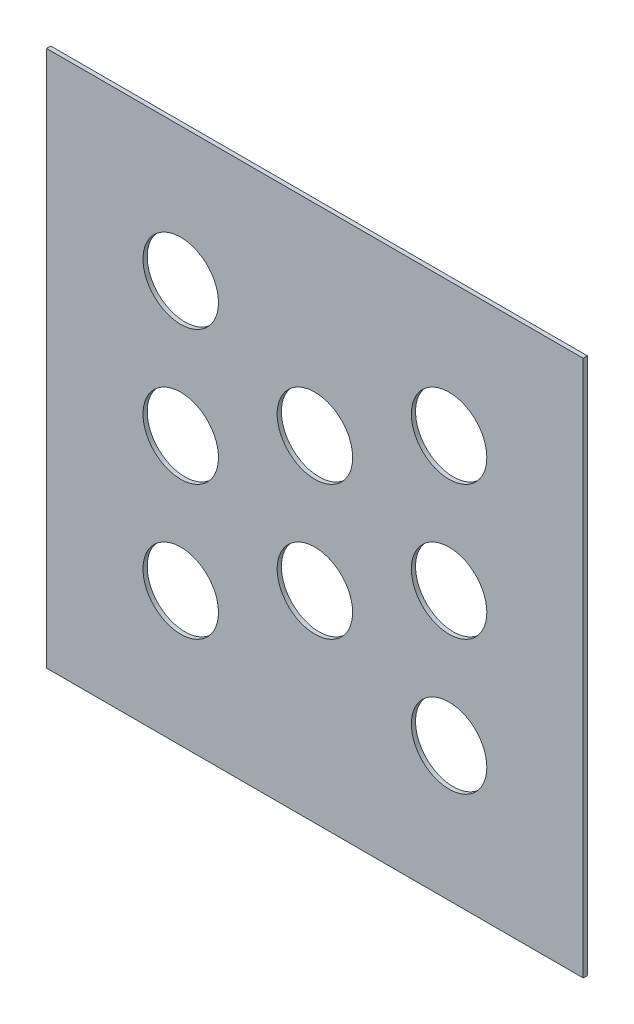
ISO-10303-21;
HEADER;
FILE_DESCRIPTION(('STEP AP214'),'2;1');
FILE_NAME('part.step','',(''),(''),'','','');
FILE_SCHEMA(('AUTOMOTIVE_DESIGN { 1 0 10303 214 1 1 1 1 }'));
ENDSEC;
DATA;
#1=APPLICATION_CONTEXT('core data for automotive mechanical design processes');
#2=APPLICATION_PROTOCOL_DEFINITION('international standard','automotive_design',2000,#1);
#3=PRODUCT_CONTEXT('',#1,'mechanical');
#4=PRODUCT('Part','Part','',(#3));
#5=PRODUCT_RELATED_PRODUCT_CATEGORY('part','',(#4));
#6=PRODUCT_DEFINITION_FORMATION('','',#4);
#7=PRODUCT_DEFINITION_CONTEXT('part definition',#1,'design');
#8=PRODUCT_DEFINITION('design','',#6,#7);
#9=PRODUCT_DEFINITION_SHAPE('','',#8);
#10=(LENGTH_UNIT() NAMED_UNIT(*) SI_UNIT(.MILLI.,.METRE.));
#11=(NAMED_UNIT(*) PLANE_ANGLE_UNIT() SI_UNIT($,.RADIAN.));
#12=(NAMED_UNIT(*) SI_UNIT($,.STERADIAN.) SOLID_ANGLE_UNIT());
#13=UNCERTAINTY_MEASURE_WITH_UNIT(LENGTH_MEASURE(1.E-05),#10,'distance_accuracy_value','');
#14=(GEOMETRIC_REPRESENTATION_CONTEXT(3) GLOBAL_UNCERTAINTY_ASSIGNED_CONTEXT((#13)) GLOBAL_UNIT_ASSIGNED_CONTEXT((#10,
#11,#12)) REPRESENTATION_CONTEXT('',''));
#15=CARTESIAN_POINT('',(0.,0.,0.));
#16=DIRECTION('',(0.,0.,1.));
#17=DIRECTION('',(1.,0.,0.));
#18=AXIS2_PLACEMENT_3D('',#15,#16,#17);
#19=CARTESIAN_POINT('',(0.,-203.2,1.5875));
#20=DIRECTION('',(0.,0.,1.));
#21=DIRECTION('',(1.,0.,0.));
#22=AXIS2_PLACEMENT_3D('',#19,#20,#21);
#23=PLANE('',#22);
#24=CARTESIAN_POINT('',(50.800000000001,-152.400000000001,1.5875));
#25=DIRECTION('',(0.,0.,1.));
#26=DIRECTION('',(1.,0.,0.));
#27=AXIS2_PLACEMENT_3D('',#24,#25,#26);
#28=CIRCLE('',#27,14.2875);
#29=CARTESIAN_POINT('',(65.087500000001,-152.400000000001,1.5875));
#30=VERTEX_POINT('',#29);
#31=EDGE_CURVE('E148',#30,#30,#28,.T.);
#32=ORIENTED_EDGE('',*,*,#31,.F.);
#33=EDGE_LOOP('',(#32));
#34=FACE_BOUND('',#33,.T.);
#35=CARTESIAN_POINT('',(50.8,-50.8000000000007,1.5875));
#36=DIRECTION('',(0.,0.,1.));
#37=DIRECTION('',(1.,0.,0.));
#38=AXIS2_PLACEMENT_3D('',#35,#36,#37);
#39=CIRCLE('',#38,14.2875);
#40=CARTESIAN_POINT('',(65.0875,-50.8000000000007,1.5875));
#41=VERTEX_POINT('',#40);
#42=EDGE_CURVE('E136',#41,#41,#39,.T.);
#43=ORIENTED_EDGE('',*,*,#42,.F.);
#44=EDGE_LOOP('',(#43));
#45=FACE_BOUND('',#44,.T.);
#46=CARTESIAN_POINT('',(152.400000000001,-101.6,1.5875));
#47=DIRECTION('',(0.,0.,1.));
#48=DIRECTION('',(1.,0.,0.));
#49=AXIS2_PLACEMENT_3D('',#46,#47,#48);
#50=CIRCLE('',#49,14.2875);
#51=CARTESIAN_POINT('',(166.687500000001,-101.6,1.5875));
#52=VERTEX_POINT('',#51);
#53=EDGE_CURVE('E124',#52,#52,#50,.T.);
#54=ORIENTED_EDGE('',*,*,#53,.F.);
#55=EDGE_LOOP('',(#54));
#56=FACE_BOUND('',#55,.T.);
#57=CARTESIAN_POINT('',(152.4,-50.8,1.5875));
#58=DIRECTION('',(0.,0.,1.));
#59=DIRECTION('',(1.,0.,0.));
#60=AXIS2_PLACEMENT_3D('',#57,#58,#59);
#61=CIRCLE('',#60,14.2875);
#62=CARTESIAN_POINT('',(166.6875,-50.8,1.5875));
#63=VERTEX_POINT('',#62);
#64=EDGE_CURVE('E103',#63,#63,#61,.T.);
#65=ORIENTED_EDGE('',*,*,#64,.F.);
#66=EDGE_LOOP('',(#65));
#67=FACE_BOUND('',#66,.T.);
#68=DIRECTION('',(0.,-1.,0.));
#69=VECTOR('',#68,1.);
#70=CARTESIAN_POINT('',(0.,0.,1.5875));
#71=LINE('',#70,#69);
#72=CARTESIAN_POINT('',(0.,0.,1.5875));
#73=VERTEX_POINT('',#72);
#74=CARTESIAN_POINT('',(0.,-203.2,1.5875));
#75=VERTEX_POINT('',#74);
#76=EDGE_CURVE('E88',#73,#75,#71,.T.);
#77=ORIENTED_EDGE('',*,*,#76,.T.);
#78=DIRECTION('',(1.,0.,0.));
#79=VECTOR('',#78,1.);
#80=CARTESIAN_POINT('',(0.,-203.2,1.5875));
#81=LINE('',#80,#79);
#82=CARTESIAN_POINT('',(203.2,-203.2,1.5875));
#83=VERTEX_POINT('',#82);
#84=EDGE_CURVE('E83',#75,#83,#81,.T.);
#85=ORIENTED_EDGE('',*,*,#84,.T.);
#86=DIRECTION('',(0.,1.,0.));
#87=VECTOR('',#86,1.);
#88=CARTESIAN_POINT('',(203.2,0.,1.5875));
#89=LINE('',#88,#87);
#90=CARTESIAN_POINT('',(203.2,0.,1.5875));
#91=VERTEX_POINT('',#90);
#92=EDGE_CURVE('E86',#83,#91,#89,.T.);
#93=ORIENTED_EDGE('',*,*,#92,.T.);
#94=DIRECTION('',(-1.,0.,0.));
#95=VECTOR('',#94,1.);
#96=CARTESIAN_POINT('',(0.,0.,1.5875));
#97=LINE('',#96,#95);
#98=EDGE_CURVE('E53',#91,#73,#97,.T.);
#99=ORIENTED_EDGE('',*,*,#98,.T.);
#100=EDGE_LOOP('',(#77,#85,#93,#99));
#101=FACE_BOUND('',#100,.T.);
#102=CARTESIAN_POINT('',(101.6,-76.2,1.5875));
#103=DIRECTION('',(0.,0.,1.));
#104=DIRECTION('',(1.,0.,0.));
#105=AXIS2_PLACEMENT_3D('',#102,#103,#104);
#106=CIRCLE('',#105,14.2875);
#107=CARTESIAN_POINT('',(115.8875,-76.2,1.5875));
#108=VERTEX_POINT('',#107);
#109=EDGE_CURVE('E118',#108,#108,#106,.T.);
#110=ORIENTED_EDGE('',*,*,#109,.F.);
#111=EDGE_LOOP('',(#110));
#112=FACE_BOUND('',#111,.T.);
#113=CARTESIAN_POINT('',(152.400000000001,-152.4,1.5875));
#114=DIRECTION('',(0.,0.,1.));
#115=DIRECTION('',(1.,0.,0.));
#116=AXIS2_PLACEMENT_3D('',#113,#114,#115);
#117=CIRCLE('',#116,14.2875);
#118=CARTESIAN_POINT('',(166.687500000001,-152.4,1.5875));
#119=VERTEX_POINT('',#118);
#120=EDGE_CURVE('E130',#119,#119,#117,.T.);
#121=ORIENTED_EDGE('',*,*,#120,.F.);
#122=EDGE_LOOP('',(#121));
#123=FACE_BOUND('',#122,.T.);
#124=CARTESIAN_POINT('',(50.8000000000005,-101.600000000001,1.5875));
#125=DIRECTION('',(0.,0.,1.));
#126=DIRECTION('',(1.,0.,0.));
#127=AXIS2_PLACEMENT_3D('',#124,#125,#126);
#128=CIRCLE('',#127,14.2875);
#129=CARTESIAN_POINT('',(65.0875000000005,-101.600000000001,1.5875));
#130=VERTEX_POINT('',#129);
#131=EDGE_CURVE('E142',#130,#130,#128,.T.);
#132=ORIENTED_EDGE('',*,*,#131,.F.);
#133=EDGE_LOOP('',(#132));
#134=FACE_BOUND('',#133,.T.);
#135=CARTESIAN_POINT('',(101.600000000001,-127.,1.5875));
#136=DIRECTION('',(0.,0.,1.));
#137=DIRECTION('',(1.,0.,0.));
#138=AXIS2_PLACEMENT_3D('',#135,#136,#137);
#139=CIRCLE('',#138,14.2875);
#140=CARTESIAN_POINT('',(115.887500000001,-127.,1.5875));
#141=VERTEX_POINT('',#140);
#142=EDGE_CURVE('E154',#141,#141,#139,.T.);
#143=ORIENTED_EDGE('',*,*,#142,.F.);
#144=EDGE_LOOP('',(#143));
#145=FACE_BOUND('',#144,.T.);
#146=ADVANCED_FACE('F36',(#34,#45,#56,#67,#101,#112,#123,#134,#145),#23,.T.);
#147=CARTESIAN_POINT('',(0.,-203.2,0.));
#148=DIRECTION('',(0.,0.,1.));
#149=DIRECTION('',(1.,0.,0.));
#150=AXIS2_PLACEMENT_3D('',#147,#148,#149);
#151=PLANE('',#150);
#152=CARTESIAN_POINT('',(50.800000000001,-152.400000000001,0.));
#153=DIRECTION('',(0.,0.,1.));
#154=DIRECTION('',(1.,0.,0.));
#155=AXIS2_PLACEMENT_3D('',#152,#153,#154);
#156=CIRCLE('',#155,14.2875);
#157=CARTESIAN_POINT('',(65.087500000001,-152.400000000001,0.));
#158=VERTEX_POINT('',#157);
#159=EDGE_CURVE('E151',#158,#158,#156,.T.);
#160=ORIENTED_EDGE('',*,*,#159,.T.);
#161=EDGE_LOOP('',(#160));
#162=FACE_BOUND('',#161,.T.);
#163=CARTESIAN_POINT('',(50.8,-50.8000000000007,0.));
#164=DIRECTION('',(0.,0.,1.));
#165=DIRECTION('',(1.,0.,0.));
#166=AXIS2_PLACEMENT_3D('',#163,#164,#165);
#167=CIRCLE('',#166,14.2875);
#168=CARTESIAN_POINT('',(65.0875,-50.8000000000007,0.));
#169=VERTEX_POINT('',#168);
#170=EDGE_CURVE('E139',#169,#169,#167,.T.);
#171=ORIENTED_EDGE('',*,*,#170,.T.);
#172=EDGE_LOOP('',(#171));
#173=FACE_BOUND('',#172,.T.);
#174=CARTESIAN_POINT('',(152.400000000001,-101.6,0.));
#175=DIRECTION('',(0.,0.,1.));
#176=DIRECTION('',(1.,0.,0.));
#177=AXIS2_PLACEMENT_3D('',#174,#175,#176);
#178=CIRCLE('',#177,14.2875);
#179=CARTESIAN_POINT('',(166.687500000001,-101.6,0.));
#180=VERTEX_POINT('',#179);
#181=EDGE_CURVE('E127',#180,#180,#178,.T.);
#182=ORIENTED_EDGE('',*,*,#181,.T.);
#183=EDGE_LOOP('',(#182));
#184=FACE_BOUND('',#183,.T.);
#185=CARTESIAN_POINT('',(152.4,-50.8,0.));
#186=DIRECTION('',(0.,0.,1.));
#187=DIRECTION('',(1.,0.,0.));
#188=AXIS2_PLACEMENT_3D('',#185,#186,#187);
#189=CIRCLE('',#188,14.2875);
#190=CARTESIAN_POINT('',(166.6875,-50.8,0.));
#191=VERTEX_POINT('',#190);
#192=EDGE_CURVE('E115',#191,#191,#189,.T.);
#193=ORIENTED_EDGE('',*,*,#192,.T.);
#194=EDGE_LOOP('',(#193));
#195=FACE_BOUND('',#194,.T.);
#196=DIRECTION('',(0.,-1.,0.));
#197=VECTOR('',#196,1.);
#198=CARTESIAN_POINT('',(0.,0.,0.));
#199=LINE('',#198,#197);
#200=CARTESIAN_POINT('',(0.,0.,0.));
#201=VERTEX_POINT('',#200);
#202=CARTESIAN_POINT('',(0.,-203.2,0.));
#203=VERTEX_POINT('',#202);
#204=EDGE_CURVE('E100',#201,#203,#199,.T.);
#205=ORIENTED_EDGE('',*,*,#204,.F.);
#206=DIRECTION('',(-1.,0.,0.));
#207=VECTOR('',#206,1.);
#208=CARTESIAN_POINT('',(0.,0.,0.));
#209=LINE('',#208,#207);
#210=CARTESIAN_POINT('',(203.2,0.,0.));
#211=VERTEX_POINT('',#210);
#212=EDGE_CURVE('E76',#211,#201,#209,.T.);
#213=ORIENTED_EDGE('',*,*,#212,.F.);
#214=DIRECTION('',(0.,1.,0.));
#215=VECTOR('',#214,1.);
#216=CARTESIAN_POINT('',(203.2,0.,0.));
#217=LINE('',#216,#215);
#218=CARTESIAN_POINT('',(203.2,-203.2,0.));
#219=VERTEX_POINT('',#218);
#220=EDGE_CURVE('E70',#219,#211,#217,.T.);
#221=ORIENTED_EDGE('',*,*,#220,.F.);
#222=DIRECTION('',(1.,0.,0.));
#223=VECTOR('',#222,1.);
#224=CARTESIAN_POINT('',(0.,-203.2,0.));
#225=LINE('',#224,#223);
#226=EDGE_CURVE('E92',#203,#219,#225,.T.);
#227=ORIENTED_EDGE('',*,*,#226,.F.);
#228=EDGE_LOOP('',(#205,#213,#221,#227));
#229=FACE_BOUND('',#228,.T.);
#230=CARTESIAN_POINT('',(101.6,-76.2,0.));
#231=DIRECTION('',(0.,0.,1.));
#232=DIRECTION('',(1.,0.,0.));
#233=AXIS2_PLACEMENT_3D('',#230,#231,#232);
#234=CIRCLE('',#233,14.2875);
#235=CARTESIAN_POINT('',(115.8875,-76.2,0.));
#236=VERTEX_POINT('',#235);
#237=EDGE_CURVE('E121',#236,#236,#234,.T.);
#238=ORIENTED_EDGE('',*,*,#237,.T.);
#239=EDGE_LOOP('',(#238));
#240=FACE_BOUND('',#239,.T.);
#241=CARTESIAN_POINT('',(152.400000000001,-152.4,0.));
#242=DIRECTION('',(0.,0.,1.));
#243=DIRECTION('',(1.,0.,0.));
#244=AXIS2_PLACEMENT_3D('',#241,#242,#243);
#245=CIRCLE('',#244,14.2875);
#246=CARTESIAN_POINT('',(166.687500000001,-152.4,0.));
#247=VERTEX_POINT('',#246);
#248=EDGE_CURVE('E133',#247,#247,#245,.T.);
#249=ORIENTED_EDGE('',*,*,#248,.T.);
#250=EDGE_LOOP('',(#249));
#251=FACE_BOUND('',#250,.T.);
#252=CARTESIAN_POINT('',(50.8000000000005,-101.600000000001,0.));
#253=DIRECTION('',(0.,0.,1.));
#254=DIRECTION('',(1.,0.,0.));
#255=AXIS2_PLACEMENT_3D('',#252,#253,#254);
#256=CIRCLE('',#255,14.2875);
#257=CARTESIAN_POINT('',(65.0875000000005,-101.600000000001,0.));
#258=VERTEX_POINT('',#257);
#259=EDGE_CURVE('E145',#258,#258,#256,.T.);
#260=ORIENTED_EDGE('',*,*,#259,.T.);
#261=EDGE_LOOP('',(#260));
#262=FACE_BOUND('',#261,.T.);
#263=CARTESIAN_POINT('',(101.600000000001,-127.,0.));
#264=DIRECTION('',(0.,0.,1.));
#265=DIRECTION('',(1.,0.,0.));
#266=AXIS2_PLACEMENT_3D('',#263,#264,#265);
#267=CIRCLE('',#266,14.2875);
#268=CARTESIAN_POINT('',(115.887500000001,-127.,0.));
#269=VERTEX_POINT('',#268);
#270=EDGE_CURVE('E157',#269,#269,#267,.T.);
#271=ORIENTED_EDGE('',*,*,#270,.T.);
#272=EDGE_LOOP('',(#271));
#273=FACE_BOUND('',#272,.T.);
#274=ADVANCED_FACE('F111',(#162,#173,#184,#195,#229,#240,#251,#262,#273),#151,.F.);
#275=CARTESIAN_POINT('',(0.,0.,1.5875));
#276=DIRECTION('',(1.,0.,0.));
#277=DIRECTION('',(0.,1.,0.));
#278=AXIS2_PLACEMENT_3D('',#275,#276,#277);
#279=PLANE('',#278);
#280=ORIENTED_EDGE('',*,*,#204,.T.);
#281=DIRECTION('',(0.,0.,-1.));
#282=VECTOR('',#281,1.);
#283=CARTESIAN_POINT('',(0.,-203.2,1.5875));
#284=LINE('',#283,#282);
#285=EDGE_CURVE('E11',#75,#203,#284,.T.);
#286=ORIENTED_EDGE('',*,*,#285,.F.);
#287=ORIENTED_EDGE('',*,*,#76,.F.);
#288=DIRECTION('',(0.,0.,-1.));
#289=VECTOR('',#288,1.);
#290=CARTESIAN_POINT('',(0.,0.,1.5875));
#291=LINE('',#290,#289);
#292=EDGE_CURVE('E96',#73,#201,#291,.T.);
#293=ORIENTED_EDGE('',*,*,#292,.T.);
#294=EDGE_LOOP('',(#280,#286,#287,#293));
#295=FACE_BOUND('',#294,.T.);
#296=ADVANCED_FACE('F38',(#295),#279,.F.);
#297=CARTESIAN_POINT('',(0.,-203.2,1.5875));
#298=DIRECTION('',(0.,1.,0.));
#299=DIRECTION('',(0.,0.,1.));
#300=AXIS2_PLACEMENT_3D('',#297,#298,#299);
#301=PLANE('',#300);
#302=ORIENTED_EDGE('',*,*,#226,.T.);
#303=DIRECTION('',(0.,0.,-1.));
#304=VECTOR('',#303,1.);
#305=CARTESIAN_POINT('',(203.2,-203.2,1.5875));
#306=LINE('',#305,#304);
#307=EDGE_CURVE('E45',#83,#219,#306,.T.);
#308=ORIENTED_EDGE('',*,*,#307,.F.);
#309=ORIENTED_EDGE('',*,*,#84,.F.);
#310=ORIENTED_EDGE('',*,*,#285,.T.);
#311=EDGE_LOOP('',(#302,#308,#309,#310));
#312=FACE_BOUND('',#311,.T.);
#313=ADVANCED_FACE('F91',(#312),#301,.F.);
#314=CARTESIAN_POINT('',(203.2,0.,1.5875));
#315=DIRECTION('',(-1.,0.,0.));
#316=DIRECTION('',(0.,-1.,0.));
#317=AXIS2_PLACEMENT_3D('',#314,#315,#316);
#318=PLANE('',#317);
#319=ORIENTED_EDGE('',*,*,#220,.T.);
#320=DIRECTION('',(0.,0.,-1.));
#321=VECTOR('',#320,1.);
#322=CARTESIAN_POINT('',(203.2,0.,1.5875));
#323=LINE('',#322,#321);
#324=EDGE_CURVE('E93',#91,#211,#323,.T.);
#325=ORIENTED_EDGE('',*,*,#324,.F.);
#326=ORIENTED_EDGE('',*,*,#92,.F.);
#327=ORIENTED_EDGE('',*,*,#307,.T.);
#328=EDGE_LOOP('',(#319,#325,#326,#327));
#329=FACE_BOUND('',#328,.T.);
#330=ADVANCED_FACE('F94',(#329),#318,.F.);
#331=CARTESIAN_POINT('',(0.,0.,1.5875));
#332=DIRECTION('',(0.,-1.,0.));
#333=DIRECTION('',(0.,0.,-1.));
#334=AXIS2_PLACEMENT_3D('',#331,#332,#333);
#335=PLANE('',#334);
#336=ORIENTED_EDGE('',*,*,#212,.T.);
#337=ORIENTED_EDGE('',*,*,#292,.F.);
#338=ORIENTED_EDGE('',*,*,#98,.F.);
#339=ORIENTED_EDGE('',*,*,#324,.T.);
#340=EDGE_LOOP('',(#336,#337,#338,#339));
#341=FACE_BOUND('',#340,.T.);
#342=ADVANCED_FACE('F108',(#341),#335,.F.);
#343=CARTESIAN_POINT('',(152.4,-50.8,1.5875));
#344=DIRECTION('',(0.,0.,-1.));
#345=DIRECTION('',(-1.,0.,0.));
#346=AXIS2_PLACEMENT_3D('',#343,#344,#345);
#347=CYLINDRICAL_SURFACE('',#346,14.2875);
#348=ORIENTED_EDGE('',*,*,#64,.T.);
#349=EDGE_LOOP('',(#348));
#350=FACE_BOUND('',#349,.T.);
#351=ORIENTED_EDGE('',*,*,#192,.F.);
#352=EDGE_LOOP('',(#351));
#353=FACE_BOUND('',#352,.T.);
#354=ADVANCED_FACE('F177',(#350,#353),#347,.F.);
#355=CARTESIAN_POINT('',(101.6,-76.2,1.5875));
#356=DIRECTION('',(0.,0.,-1.));
#357=DIRECTION('',(-1.,0.,0.));
#358=AXIS2_PLACEMENT_3D('',#355,#356,#357);
#359=CYLINDRICAL_SURFACE('',#358,14.2875);
#360=ORIENTED_EDGE('',*,*,#109,.T.);
#361=EDGE_LOOP('',(#360));
#362=FACE_BOUND('',#361,.T.);
#363=ORIENTED_EDGE('',*,*,#237,.F.);
#364=EDGE_LOOP('',(#363));
#365=FACE_BOUND('',#364,.T.);
#366=ADVANCED_FACE('F223',(#362,#365),#359,.F.);
#367=CARTESIAN_POINT('',(152.400000000001,-101.6,1.5875));
#368=DIRECTION('',(0.,0.,-1.));
#369=DIRECTION('',(-1.,0.,0.));
#370=AXIS2_PLACEMENT_3D('',#367,#368,#369);
#371=CYLINDRICAL_SURFACE('',#370,14.2875);
#372=ORIENTED_EDGE('',*,*,#53,.T.);
#373=EDGE_LOOP('',(#372));
#374=FACE_BOUND('',#373,.T.);
#375=ORIENTED_EDGE('',*,*,#181,.F.);
#376=EDGE_LOOP('',(#375));
#377=FACE_BOUND('',#376,.T.);
#378=ADVANCED_FACE('F231',(#374,#377),#371,.F.);
#379=CARTESIAN_POINT('',(152.400000000001,-152.4,1.5875));
#380=DIRECTION('',(0.,0.,-1.));
#381=DIRECTION('',(-1.,0.,0.));
#382=AXIS2_PLACEMENT_3D('',#379,#380,#381);
#383=CYLINDRICAL_SURFACE('',#382,14.2875);
#384=ORIENTED_EDGE('',*,*,#120,.T.);
#385=EDGE_LOOP('',(#384));
#386=FACE_BOUND('',#385,.T.);
#387=ORIENTED_EDGE('',*,*,#248,.F.);
#388=EDGE_LOOP('',(#387));
#389=FACE_BOUND('',#388,.T.);
#390=ADVANCED_FACE('F239',(#386,#389),#383,.F.);
#391=CARTESIAN_POINT('',(50.8,-50.8000000000007,1.5875));
#392=DIRECTION('',(0.,0.,-1.));
#393=DIRECTION('',(-1.,0.,0.));
#394=AXIS2_PLACEMENT_3D('',#391,#392,#393);
#395=CYLINDRICAL_SURFACE('',#394,14.2875);
#396=ORIENTED_EDGE('',*,*,#42,.T.);
#397=EDGE_LOOP('',(#396));
#398=FACE_BOUND('',#397,.T.);
#399=ORIENTED_EDGE('',*,*,#170,.F.);
#400=EDGE_LOOP('',(#399));
#401=FACE_BOUND('',#400,.T.);
#402=ADVANCED_FACE('F248',(#398,#401),#395,.F.);
#403=CARTESIAN_POINT('',(50.8000000000005,-101.600000000001,1.5875));
#404=DIRECTION('',(0.,0.,-1.));
#405=DIRECTION('',(-1.,0.,0.));
#406=AXIS2_PLACEMENT_3D('',#403,#404,#405);
#407=CYLINDRICAL_SURFACE('',#406,14.2875);
#408=ORIENTED_EDGE('',*,*,#131,.T.);
#409=EDGE_LOOP('',(#408));
#410=FACE_BOUND('',#409,.T.);
#411=ORIENTED_EDGE('',*,*,#259,.F.);
#412=EDGE_LOOP('',(#411));
#413=FACE_BOUND('',#412,.T.);
#414=ADVANCED_FACE('F257',(#410,#413),#407,.F.);
#415=CARTESIAN_POINT('',(50.800000000001,-152.400000000001,1.5875));
#416=DIRECTION('',(0.,0.,-1.));
#417=DIRECTION('',(-1.,0.,0.));
#418=AXIS2_PLACEMENT_3D('',#415,#416,#417);
#419=CYLINDRICAL_SURFACE('',#418,14.2875);
#420=ORIENTED_EDGE('',*,*,#31,.T.);
#421=EDGE_LOOP('',(#420));
#422=FACE_BOUND('',#421,.T.);
#423=ORIENTED_EDGE('',*,*,#159,.F.);
#424=EDGE_LOOP('',(#423));
#425=FACE_BOUND('',#424,.T.);
#426=ADVANCED_FACE('F266',(#422,#425),#419,.F.);
#427=CARTESIAN_POINT('',(101.600000000001,-127.,1.5875));
#428=DIRECTION('',(0.,0.,-1.));
#429=DIRECTION('',(-1.,0.,0.));
#430=AXIS2_PLACEMENT_3D('',#427,#428,#429);
#431=CYLINDRICAL_SURFACE('',#430,14.2875);
#432=ORIENTED_EDGE('',*,*,#142,.T.);
#433=EDGE_LOOP('',(#432));
#434=FACE_BOUND('',#433,.T.);
#435=ORIENTED_EDGE('',*,*,#270,.F.);
#436=EDGE_LOOP('',(#435));
#437=FACE_BOUND('',#436,.T.);
#438=ADVANCED_FACE('F163',(#434,#437),#431,.F.);
#439=CLOSED_SHELL('',(#146,#274,#296,#313,#330,#342,#354,#366,#378,#390,#402,#414,#426,#438));
#440=MANIFOLD_SOLID_BREP('B2',#439);
#441=ADVANCED_BREP_SHAPE_REPRESENTATION('',(#18,#440),#14);
#442=SHAPE_DEFINITION_REPRESENTATION(#9,#441);
ENDSEC;
END-ISO-10303-21;
